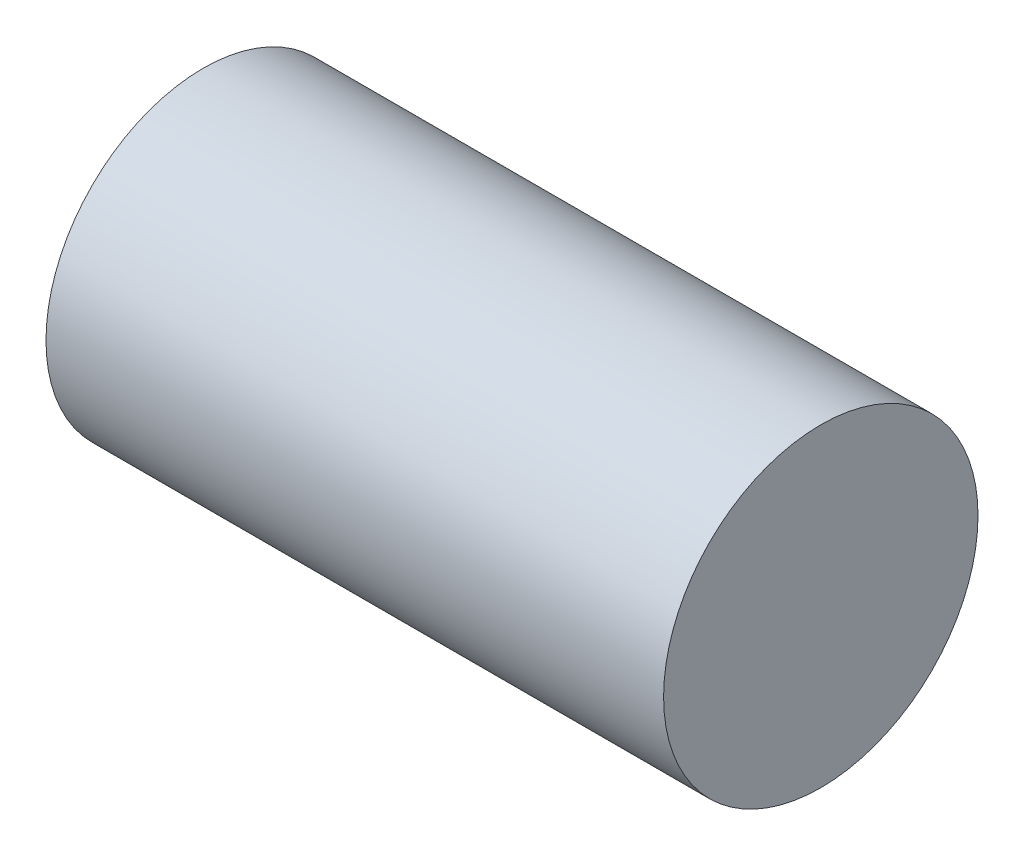
ISO-10303-21;
HEADER;
FILE_DESCRIPTION(('STEP AP214'),'2;1');
FILE_NAME('part.step','',(''),(''),'','','');
FILE_SCHEMA(('AUTOMOTIVE_DESIGN { 1 0 10303 214 1 1 1 1 }'));
ENDSEC;
DATA;
#1=APPLICATION_CONTEXT('core data for automotive mechanical design processes');
#2=APPLICATION_PROTOCOL_DEFINITION('international standard','automotive_design',2000,#1);
#3=PRODUCT_CONTEXT('',#1,'mechanical');
#4=PRODUCT('Part','Part','',(#3));
#5=PRODUCT_RELATED_PRODUCT_CATEGORY('part','',(#4));
#6=PRODUCT_DEFINITION_FORMATION('','',#4);
#7=PRODUCT_DEFINITION_CONTEXT('part definition',#1,'design');
#8=PRODUCT_DEFINITION('design','',#6,#7);
#9=PRODUCT_DEFINITION_SHAPE('','',#8);
#10=(LENGTH_UNIT() NAMED_UNIT(*) SI_UNIT(.MILLI.,.METRE.));
#11=(NAMED_UNIT(*) PLANE_ANGLE_UNIT() SI_UNIT($,.RADIAN.));
#12=(NAMED_UNIT(*) SI_UNIT($,.STERADIAN.) SOLID_ANGLE_UNIT());
#13=UNCERTAINTY_MEASURE_WITH_UNIT(LENGTH_MEASURE(1.E-05),#10,'distance_accuracy_value','');
#14=(GEOMETRIC_REPRESENTATION_CONTEXT(3) GLOBAL_UNCERTAINTY_ASSIGNED_CONTEXT((#13)) GLOBAL_UNIT_ASSIGNED_CONTEXT((#10,
#11,#12)) REPRESENTATION_CONTEXT('',''));
#15=CARTESIAN_POINT('',(0.,0.,0.));
#16=DIRECTION('',(0.,0.,1.));
#17=DIRECTION('',(1.,0.,0.));
#18=AXIS2_PLACEMENT_3D('',#15,#16,#17);
#19=CARTESIAN_POINT('',(0.,0.,0.));
#20=DIRECTION('',(1.,0.,0.));
#21=DIRECTION('',(0.,0.,-1.));
#22=AXIS2_PLACEMENT_3D('',#19,#20,#21);
#23=PLANE('',#22);
#24=CARTESIAN_POINT('',(0.,0.,0.));
#25=DIRECTION('',(1.,0.,0.));
#26=DIRECTION('',(0.,0.,-1.));
#27=AXIS2_PLACEMENT_3D('',#24,#25,#26);
#28=CIRCLE('',#27,6.35);
#29=CARTESIAN_POINT('',(0.,0.,-6.35));
#30=VERTEX_POINT('',#29);
#31=EDGE_CURVE('E45',#30,#30,#28,.F.);
#32=ORIENTED_EDGE('',*,*,#31,.F.);
#33=EDGE_LOOP('',(#32));
#34=FACE_BOUND('',#33,.T.);
#35=CARTESIAN_POINT('',(0.,0.,0.));
#36=DIRECTION('',(-1.,0.,0.));
#37=DIRECTION('',(0.,0.,1.));
#38=AXIS2_PLACEMENT_3D('',#35,#36,#37);
#39=CIRCLE('',#38,14.);
#40=CARTESIAN_POINT('',(0.,0.,14.));
#41=VERTEX_POINT('',#40);
#42=EDGE_CURVE('E10',#41,#41,#39,.T.);
#43=ORIENTED_EDGE('',*,*,#42,.T.);
#44=EDGE_LOOP('',(#43));
#45=FACE_BOUND('',#44,.T.);
#46=ADVANCED_FACE('F39',(#34,#45),#23,.F.);
#47=CARTESIAN_POINT('',(-1000.,0.,0.));
#48=DIRECTION('',(-1.,0.,0.));
#49=DIRECTION('',(0.,0.,1.));
#50=AXIS2_PLACEMENT_3D('',#47,#48,#49);
#51=CYLINDRICAL_SURFACE('',#50,14.);
#52=ORIENTED_EDGE('',*,*,#42,.F.);
#53=EDGE_LOOP('',(#52));
#54=FACE_BOUND('',#53,.T.);
#55=CARTESIAN_POINT('',(54.9999999999999,0.,0.));
#56=DIRECTION('',(-1.,0.,0.));
#57=DIRECTION('',(0.,0.,1.));
#58=AXIS2_PLACEMENT_3D('',#55,#56,#57);
#59=CIRCLE('',#58,14.);
#60=CARTESIAN_POINT('',(54.9999999999999,0.,14.));
#61=VERTEX_POINT('',#60);
#62=EDGE_CURVE('E46',#61,#61,#59,.T.);
#63=ORIENTED_EDGE('',*,*,#62,.T.);
#64=EDGE_LOOP('',(#63));
#65=FACE_BOUND('',#64,.T.);
#66=ADVANCED_FACE('F65',(#54,#65),#51,.T.);
#67=CARTESIAN_POINT('',(55.,14.,0.));
#68=DIRECTION('',(-1.,0.,0.));
#69=DIRECTION('',(0.,0.,1.));
#70=AXIS2_PLACEMENT_3D('',#67,#68,#69);
#71=PLANE('',#70);
#72=ORIENTED_EDGE('',*,*,#62,.F.);
#73=EDGE_LOOP('',(#72));
#74=FACE_BOUND('',#73,.T.);
#75=ADVANCED_FACE('F70',(#74),#71,.F.);
#76=CARTESIAN_POINT('',(-1000.,0.,0.));
#77=DIRECTION('',(-1.,0.,0.));
#78=DIRECTION('',(0.,0.,1.));
#79=AXIS2_PLACEMENT_3D('',#76,#77,#78);
#80=CYLINDRICAL_SURFACE('',#79,6.35);
#81=CARTESIAN_POINT('',(22.8999999999999,0.,0.));
#82=DIRECTION('',(-1.,0.,0.));
#83=DIRECTION('',(0.,0.,1.));
#84=AXIS2_PLACEMENT_3D('',#81,#82,#83);
#85=CIRCLE('',#84,6.35);
#86=CARTESIAN_POINT('',(22.8999999999999,0.,6.35));
#87=VERTEX_POINT('',#86);
#88=EDGE_CURVE('E55',#87,#87,#85,.T.);
#89=ORIENTED_EDGE('',*,*,#88,.F.);
#90=EDGE_LOOP('',(#89));
#91=FACE_BOUND('',#90,.T.);
#92=ORIENTED_EDGE('',*,*,#31,.T.);
#93=EDGE_LOOP('',(#92));
#94=FACE_BOUND('',#93,.T.);
#95=ADVANCED_FACE('F56',(#91,#94),#80,.F.);
#96=CARTESIAN_POINT('',(22.9,6.35,0.));
#97=DIRECTION('',(-1.,0.,0.));
#98=DIRECTION('',(0.,0.,1.));
#99=AXIS2_PLACEMENT_3D('',#96,#97,#98);
#100=PLANE('',#99);
#101=ORIENTED_EDGE('',*,*,#88,.T.);
#102=EDGE_LOOP('',(#101));
#103=FACE_BOUND('',#102,.T.);
#104=ADVANCED_FACE('F80',(#103),#100,.T.);
#105=CLOSED_SHELL('',(#46,#66,#75,#95,#104));
#106=MANIFOLD_SOLID_BREP('B2',#105);
#107=ADVANCED_BREP_SHAPE_REPRESENTATION('',(#18,#106),#14);
#108=SHAPE_DEFINITION_REPRESENTATION(#9,#107);
ENDSEC;
END-ISO-10303-21;
